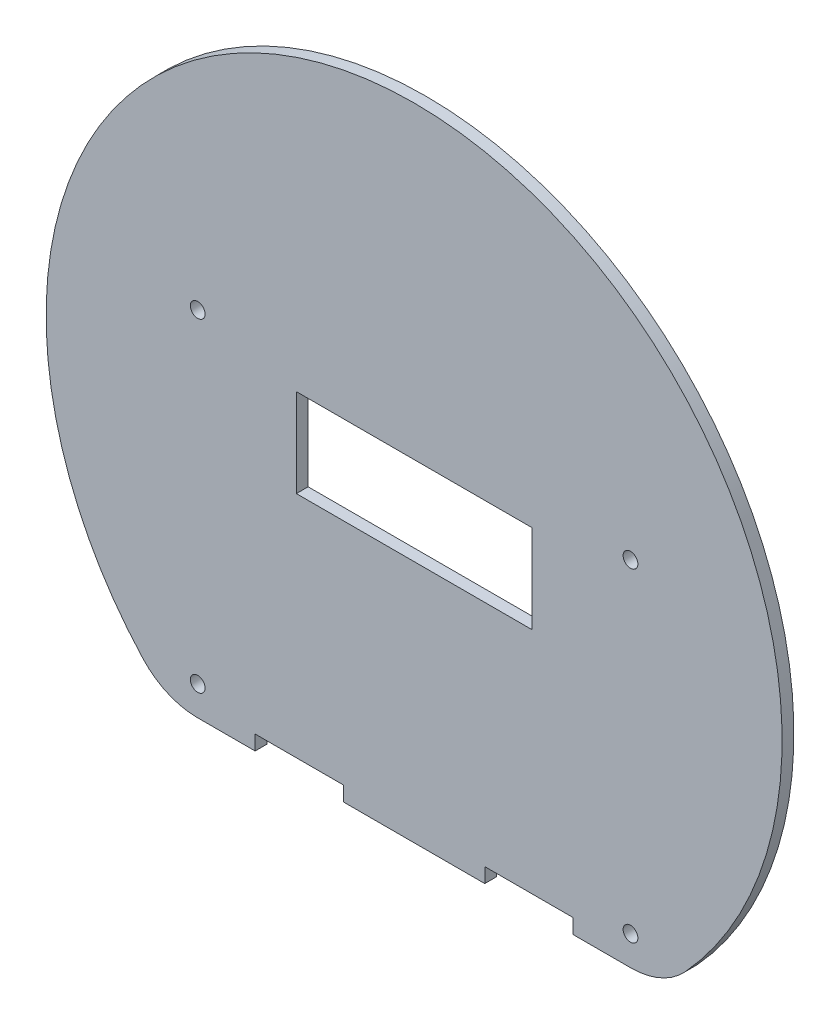
ISO-10303-21;
HEADER;
FILE_DESCRIPTION(('STEP AP214'),'2;1');
FILE_NAME('part.step','',(''),(''),'','','');
FILE_SCHEMA(('AUTOMOTIVE_DESIGN { 1 0 10303 214 1 1 1 1 }'));
ENDSEC;
DATA;
#1=APPLICATION_CONTEXT('core data for automotive mechanical design processes');
#2=APPLICATION_PROTOCOL_DEFINITION('international standard','automotive_design',2000,#1);
#3=PRODUCT_CONTEXT('',#1,'mechanical');
#4=PRODUCT('Part','Part','',(#3));
#5=PRODUCT_RELATED_PRODUCT_CATEGORY('part','',(#4));
#6=PRODUCT_DEFINITION_FORMATION('','',#4);
#7=PRODUCT_DEFINITION_CONTEXT('part definition',#1,'design');
#8=PRODUCT_DEFINITION('design','',#6,#7);
#9=PRODUCT_DEFINITION_SHAPE('','',#8);
#10=(LENGTH_UNIT() NAMED_UNIT(*) SI_UNIT(.MILLI.,.METRE.));
#11=(NAMED_UNIT(*) PLANE_ANGLE_UNIT() SI_UNIT($,.RADIAN.));
#12=(NAMED_UNIT(*) SI_UNIT($,.STERADIAN.) SOLID_ANGLE_UNIT());
#13=UNCERTAINTY_MEASURE_WITH_UNIT(LENGTH_MEASURE(1.E-05),#10,'distance_accuracy_value','');
#14=(GEOMETRIC_REPRESENTATION_CONTEXT(3) GLOBAL_UNCERTAINTY_ASSIGNED_CONTEXT((#13)) GLOBAL_UNIT_ASSIGNED_CONTEXT((#10,
#11,#12)) REPRESENTATION_CONTEXT('',''));
#15=CARTESIAN_POINT('',(0.,0.,0.));
#16=DIRECTION('',(0.,0.,1.));
#17=DIRECTION('',(1.,0.,0.));
#18=AXIS2_PLACEMENT_3D('',#15,#16,#17);
#19=CARTESIAN_POINT('',(-83.9155376460855,-92.6454669240131,-6.));
#20=DIRECTION('',(0.,1.,0.));
#21=DIRECTION('',(0.,0.,1.));
#22=AXIS2_PLACEMENT_3D('',#19,#20,#21);
#23=PLANE('',#22);
#24=DIRECTION('',(-1.,0.,0.));
#25=VECTOR('',#24,1.);
#26=CARTESIAN_POINT('',(0.,-92.6454669240131,0.));
#27=LINE('',#26,#25);
#28=CARTESIAN_POINT('',(24.,-92.6454669240131,0.));
#29=VERTEX_POINT('',#28);
#30=CARTESIAN_POINT('',(-24.,-92.6454669240131,0.));
#31=VERTEX_POINT('',#30);
#32=EDGE_CURVE('E258',#29,#31,#27,.T.);
#33=ORIENTED_EDGE('',*,*,#32,.F.);
#34=DIRECTION('',(0.,0.,1.));
#35=VECTOR('',#34,1.);
#36=CARTESIAN_POINT('',(24.,-92.6454669240131,-6.));
#37=LINE('',#36,#35);
#38=CARTESIAN_POINT('',(24.,-92.6454669240131,4.));
#39=VERTEX_POINT('',#38);
#40=EDGE_CURVE('E287',#29,#39,#37,.T.);
#41=ORIENTED_EDGE('',*,*,#40,.T.);
#42=DIRECTION('',(-1.,0.,0.));
#43=VECTOR('',#42,1.);
#44=CARTESIAN_POINT('',(-83.9155376460855,-92.6454669240131,4.));
#45=LINE('',#44,#43);
#46=CARTESIAN_POINT('',(-24.,-92.6454669240131,4.));
#47=VERTEX_POINT('',#46);
#48=EDGE_CURVE('E247',#39,#47,#45,.T.);
#49=ORIENTED_EDGE('',*,*,#48,.T.);
#50=DIRECTION('',(0.,0.,-1.));
#51=VECTOR('',#50,1.);
#52=CARTESIAN_POINT('',(-24.,-92.6454669240131,-6.));
#53=LINE('',#52,#51);
#54=EDGE_CURVE('E278',#47,#31,#53,.T.);
#55=ORIENTED_EDGE('',*,*,#54,.T.);
#56=EDGE_LOOP('',(#33,#41,#49,#55));
#57=FACE_BOUND('',#56,.T.);
#58=ADVANCED_FACE('F33',(#57),#23,.F.);
#59=CARTESIAN_POINT('',(-54.,-92.6454669240131,0.));
#60=VERTEX_POINT('',#59);
#61=CARTESIAN_POINT('',(-73.6484270343382,-92.6454669240131,0.));
#62=VERTEX_POINT('',#61);
#63=EDGE_CURVE('E251',#60,#62,#27,.T.);
#64=ORIENTED_EDGE('',*,*,#63,.F.);
#65=DIRECTION('',(0.,0.,1.));
#66=VECTOR('',#65,1.);
#67=CARTESIAN_POINT('',(-54.,-92.6454669240131,-6.));
#68=LINE('',#67,#66);
#69=CARTESIAN_POINT('',(-54.,-92.6454669240131,4.));
#70=VERTEX_POINT('',#69);
#71=EDGE_CURVE('E281',#60,#70,#68,.T.);
#72=ORIENTED_EDGE('',*,*,#71,.T.);
#73=CARTESIAN_POINT('',(-73.6484270343382,-92.6454669240131,4.));
#74=VERTEX_POINT('',#73);
#75=EDGE_CURVE('E242',#70,#74,#45,.T.);
#76=ORIENTED_EDGE('',*,*,#75,.T.);
#77=DIRECTION('',(0.,0.,-1.));
#78=VECTOR('',#77,1.);
#79=CARTESIAN_POINT('',(-73.6484270343382,-92.6454669240131,-6.));
#80=LINE('',#79,#78);
#81=EDGE_CURVE('E271',#74,#62,#80,.T.);
#82=ORIENTED_EDGE('',*,*,#81,.T.);
#83=EDGE_LOOP('',(#64,#72,#76,#82));
#84=FACE_BOUND('',#83,.T.);
#85=ADVANCED_FACE('F311',(#84),#23,.F.);
#86=CARTESIAN_POINT('',(0.,0.,4.));
#87=DIRECTION('',(0.,0.,-1.));
#88=DIRECTION('',(-1.,0.,0.));
#89=AXIS2_PLACEMENT_3D('',#86,#87,#88);
#90=CYLINDRICAL_SURFACE('',#89,125.);
#91=CARTESIAN_POINT('',(0.,0.,0.));
#92=DIRECTION('',(0.,0.,1.));
#93=DIRECTION('',(1.,0.,0.));
#94=AXIS2_PLACEMENT_3D('',#91,#92,#93);
#95=CIRCLE('',#94,125.);
#96=CARTESIAN_POINT('',(92.0605337929229,-84.5568336550164,0.));
#97=VERTEX_POINT('',#96);
#98=CARTESIAN_POINT('',(-92.0605337929228,-84.5568336550164,0.));
#99=VERTEX_POINT('',#98);
#100=EDGE_CURVE('E246',#97,#99,#95,.T.);
#101=ORIENTED_EDGE('',*,*,#100,.T.);
#102=DIRECTION('',(0.,0.,-1.));
#103=VECTOR('',#102,1.);
#104=CARTESIAN_POINT('',(-92.0605337929228,-84.5568336550164,4.));
#105=LINE('',#104,#103);
#106=CARTESIAN_POINT('',(-92.0605337929228,-84.5568336550164,4.));
#107=VERTEX_POINT('',#106);
#108=EDGE_CURVE('E260',#99,#107,#105,.F.);
#109=ORIENTED_EDGE('',*,*,#108,.T.);
#110=CARTESIAN_POINT('',(0.,0.,4.));
#111=DIRECTION('',(0.,0.,1.));
#112=DIRECTION('',(1.,0.,0.));
#113=AXIS2_PLACEMENT_3D('',#110,#111,#112);
#114=CIRCLE('',#113,125.);
#115=CARTESIAN_POINT('',(92.0605337929229,-84.5568336550164,4.));
#116=VERTEX_POINT('',#115);
#117=EDGE_CURVE('E248',#116,#107,#114,.T.);
#118=ORIENTED_EDGE('',*,*,#117,.F.);
#119=DIRECTION('',(0.,0.,-1.));
#120=VECTOR('',#119,1.);
#121=CARTESIAN_POINT('',(92.0605337929229,-84.5568336550164,4.));
#122=LINE('',#121,#120);
#123=EDGE_CURVE('E257',#116,#97,#122,.T.);
#124=ORIENTED_EDGE('',*,*,#123,.T.);
#125=EDGE_LOOP('',(#101,#109,#118,#124));
#126=FACE_BOUND('',#125,.T.);
#127=ADVANCED_FACE('F336',(#126),#90,.T.);
#128=CARTESIAN_POINT('',(0.,0.,4.));
#129=DIRECTION('',(0.,0.,1.));
#130=DIRECTION('',(1.,0.,0.));
#131=AXIS2_PLACEMENT_3D('',#128,#129,#130);
#132=PLANE('',#131);
#133=DIRECTION('',(0.,1.,0.));
#134=VECTOR('',#133,1.);
#135=CARTESIAN_POINT('',(40.,20.0744774174086,4.));
#136=LINE('',#135,#134);
#137=CARTESIAN_POINT('',(40.,-9.92552258259138,4.));
#138=VERTEX_POINT('',#137);
#139=CARTESIAN_POINT('',(40.,20.0744774174086,4.));
#140=VERTEX_POINT('',#139);
#141=EDGE_CURVE('E48',#138,#140,#136,.T.);
#142=ORIENTED_EDGE('',*,*,#141,.F.);
#143=DIRECTION('',(1.,0.,0.));
#144=VECTOR('',#143,1.);
#145=CARTESIAN_POINT('',(-40.,-9.92552258259138,4.));
#146=LINE('',#145,#144);
#147=CARTESIAN_POINT('',(-40.,-9.92552258259138,4.));
#148=VERTEX_POINT('',#147);
#149=EDGE_CURVE('E164',#148,#138,#146,.T.);
#150=ORIENTED_EDGE('',*,*,#149,.F.);
#151=DIRECTION('',(0.,-1.,0.));
#152=VECTOR('',#151,1.);
#153=CARTESIAN_POINT('',(-40.,20.0744774174086,4.));
#154=LINE('',#153,#152);
#155=CARTESIAN_POINT('',(-40.,20.0744774174086,4.));
#156=VERTEX_POINT('',#155);
#157=EDGE_CURVE('E167',#156,#148,#154,.T.);
#158=ORIENTED_EDGE('',*,*,#157,.F.);
#159=DIRECTION('',(-1.,0.,0.));
#160=VECTOR('',#159,1.);
#161=CARTESIAN_POINT('',(-40.,20.0744774174086,4.));
#162=LINE('',#161,#160);
#163=EDGE_CURVE('E173',#140,#156,#162,.T.);
#164=ORIENTED_EDGE('',*,*,#163,.F.);
#165=EDGE_LOOP('',(#142,#150,#158,#164));
#166=FACE_BOUND('',#165,.T.);
#167=CARTESIAN_POINT('',(-73.5,-82.6454669240131,4.));
#168=DIRECTION('',(0.,0.,1.));
#169=DIRECTION('',(1.,0.,0.));
#170=AXIS2_PLACEMENT_3D('',#167,#168,#169);
#171=CIRCLE('',#170,2.5);
#172=CARTESIAN_POINT('',(-71.,-82.6454669240131,4.));
#173=VERTEX_POINT('',#172);
#174=EDGE_CURVE('E179',#173,#173,#171,.T.);
#175=ORIENTED_EDGE('',*,*,#174,.F.);
#176=EDGE_LOOP('',(#175));
#177=FACE_BOUND('',#176,.T.);
#178=CARTESIAN_POINT('',(-73.5,27.3545330759869,4.));
#179=DIRECTION('',(0.,0.,1.));
#180=DIRECTION('',(1.,0.,0.));
#181=AXIS2_PLACEMENT_3D('',#178,#179,#180);
#182=CIRCLE('',#181,2.50000000000001);
#183=CARTESIAN_POINT('',(-71.,27.3545330759869,4.));
#184=VERTEX_POINT('',#183);
#185=EDGE_CURVE('E193',#184,#184,#182,.T.);
#186=ORIENTED_EDGE('',*,*,#185,.F.);
#187=EDGE_LOOP('',(#186));
#188=FACE_BOUND('',#187,.T.);
#189=CARTESIAN_POINT('',(73.5000000000001,27.3545330759869,4.));
#190=DIRECTION('',(0.,0.,1.));
#191=DIRECTION('',(1.,0.,0.));
#192=AXIS2_PLACEMENT_3D('',#189,#190,#191);
#193=CIRCLE('',#192,2.5);
#194=CARTESIAN_POINT('',(76.0000000000001,27.3545330759869,4.));
#195=VERTEX_POINT('',#194);
#196=EDGE_CURVE('E187',#195,#195,#193,.T.);
#197=ORIENTED_EDGE('',*,*,#196,.F.);
#198=EDGE_LOOP('',(#197));
#199=FACE_BOUND('',#198,.T.);
#200=CARTESIAN_POINT('',(73.5000000000001,-82.6454669240131,4.));
#201=DIRECTION('',(0.,0.,1.));
#202=DIRECTION('',(1.,0.,0.));
#203=AXIS2_PLACEMENT_3D('',#200,#201,#202);
#204=CIRCLE('',#203,2.50000000000001);
#205=CARTESIAN_POINT('',(76.0000000000001,-82.6454669240131,4.));
#206=VERTEX_POINT('',#205);
#207=EDGE_CURVE('E186',#206,#206,#204,.T.);
#208=ORIENTED_EDGE('',*,*,#207,.F.);
#209=EDGE_LOOP('',(#208));
#210=FACE_BOUND('',#209,.T.);
#211=DIRECTION('',(0.,-1.,0.));
#212=VECTOR('',#211,1.);
#213=CARTESIAN_POINT('',(24.,-92.6454669240131,4.));
#214=LINE('',#213,#212);
#215=CARTESIAN_POINT('',(24.,-87.6454669240131,4.));
#216=VERTEX_POINT('',#215);
#217=EDGE_CURVE('E207',#216,#39,#214,.T.);
#218=ORIENTED_EDGE('',*,*,#217,.F.);
#219=DIRECTION('',(-1.,0.,0.));
#220=VECTOR('',#219,1.);
#221=CARTESIAN_POINT('',(24.,-87.6454669240131,4.));
#222=LINE('',#221,#220);
#223=CARTESIAN_POINT('',(54.,-87.6454669240131,4.));
#224=VERTEX_POINT('',#223);
#225=EDGE_CURVE('E213',#224,#216,#222,.T.);
#226=ORIENTED_EDGE('',*,*,#225,.F.);
#227=DIRECTION('',(0.,1.,0.));
#228=VECTOR('',#227,1.);
#229=CARTESIAN_POINT('',(54.,-92.6454669240131,4.));
#230=LINE('',#229,#228);
#231=CARTESIAN_POINT('',(54.,-92.6454669240131,4.));
#232=VERTEX_POINT('',#231);
#233=EDGE_CURVE('E209',#232,#224,#230,.T.);
#234=ORIENTED_EDGE('',*,*,#233,.F.);
#235=CARTESIAN_POINT('',(73.6484270343383,-92.6454669240131,4.));
#236=VERTEX_POINT('',#235);
#237=EDGE_CURVE('E243',#236,#232,#45,.T.);
#238=ORIENTED_EDGE('',*,*,#237,.F.);
#239=CARTESIAN_POINT('',(73.6484270343383,-67.6454669240131,4.));
#240=DIRECTION('',(0.,0.,1.));
#241=DIRECTION('',(1.,0.,0.));
#242=AXIS2_PLACEMENT_3D('',#239,#240,#241);
#243=CIRCLE('',#242,25.);
#244=EDGE_CURVE('E263',#236,#116,#243,.T.);
#245=ORIENTED_EDGE('',*,*,#244,.T.);
#246=ORIENTED_EDGE('',*,*,#117,.T.);
#247=CARTESIAN_POINT('',(-73.6484270343382,-67.6454669240131,4.));
#248=DIRECTION('',(0.,0.,1.));
#249=DIRECTION('',(1.,0.,0.));
#250=AXIS2_PLACEMENT_3D('',#247,#248,#249);
#251=CIRCLE('',#250,25.);
#252=EDGE_CURVE('E265',#107,#74,#251,.T.);
#253=ORIENTED_EDGE('',*,*,#252,.T.);
#254=ORIENTED_EDGE('',*,*,#75,.F.);
#255=DIRECTION('',(0.,-1.,0.));
#256=VECTOR('',#255,1.);
#257=CARTESIAN_POINT('',(-54.,-92.6454669240131,4.));
#258=LINE('',#257,#256);
#259=CARTESIAN_POINT('',(-54.,-87.6454669240132,4.));
#260=VERTEX_POINT('',#259);
#261=EDGE_CURVE('E226',#260,#70,#258,.T.);
#262=ORIENTED_EDGE('',*,*,#261,.F.);
#263=DIRECTION('',(-1.,0.,0.));
#264=VECTOR('',#263,1.);
#265=CARTESIAN_POINT('',(-24.,-87.6454669240132,4.));
#266=LINE('',#265,#264);
#267=CARTESIAN_POINT('',(-24.,-87.6454669240132,4.));
#268=VERTEX_POINT('',#267);
#269=EDGE_CURVE('E223',#268,#260,#266,.T.);
#270=ORIENTED_EDGE('',*,*,#269,.F.);
#271=DIRECTION('',(0.,1.,0.));
#272=VECTOR('',#271,1.);
#273=CARTESIAN_POINT('',(-24.,-92.6454669240131,4.));
#274=LINE('',#273,#272);
#275=EDGE_CURVE('E204',#47,#268,#274,.T.);
#276=ORIENTED_EDGE('',*,*,#275,.F.);
#277=ORIENTED_EDGE('',*,*,#48,.F.);
#278=EDGE_LOOP('',(#218,#226,#234,#238,#245,#246,#253,#254,#262,#270,#276,#277));
#279=FACE_BOUND('',#278,.T.);
#280=ADVANCED_FACE('F306',(#166,#177,#188,#199,#210,#279),#132,.T.);
#281=CARTESIAN_POINT('',(0.,0.,0.));
#282=DIRECTION('',(0.,0.,1.));
#283=DIRECTION('',(1.,0.,0.));
#284=AXIS2_PLACEMENT_3D('',#281,#282,#283);
#285=PLANE('',#284);
#286=DIRECTION('',(1.,0.,0.));
#287=VECTOR('',#286,1.);
#288=CARTESIAN_POINT('',(-40.,-9.92552258259138,0.));
#289=LINE('',#288,#287);
#290=CARTESIAN_POINT('',(-40.,-9.92552258259138,0.));
#291=VERTEX_POINT('',#290);
#292=CARTESIAN_POINT('',(40.,-9.92552258259138,0.));
#293=VERTEX_POINT('',#292);
#294=EDGE_CURVE('E154',#291,#293,#289,.T.);
#295=ORIENTED_EDGE('',*,*,#294,.T.);
#296=DIRECTION('',(0.,1.,0.));
#297=VECTOR('',#296,1.);
#298=CARTESIAN_POINT('',(40.,20.0744774174086,0.));
#299=LINE('',#298,#297);
#300=CARTESIAN_POINT('',(40.,20.0744774174086,0.));
#301=VERTEX_POINT('',#300);
#302=EDGE_CURVE('E148',#293,#301,#299,.T.);
#303=ORIENTED_EDGE('',*,*,#302,.T.);
#304=DIRECTION('',(-1.,0.,0.));
#305=VECTOR('',#304,1.);
#306=CARTESIAN_POINT('',(-40.,20.0744774174086,0.));
#307=LINE('',#306,#305);
#308=CARTESIAN_POINT('',(-40.,20.0744774174086,0.));
#309=VERTEX_POINT('',#308);
#310=EDGE_CURVE('E157',#301,#309,#307,.T.);
#311=ORIENTED_EDGE('',*,*,#310,.T.);
#312=DIRECTION('',(0.,-1.,0.));
#313=VECTOR('',#312,1.);
#314=CARTESIAN_POINT('',(-40.,20.0744774174086,0.));
#315=LINE('',#314,#313);
#316=EDGE_CURVE('E56',#309,#291,#315,.T.);
#317=ORIENTED_EDGE('',*,*,#316,.T.);
#318=EDGE_LOOP('',(#295,#303,#311,#317));
#319=FACE_BOUND('',#318,.T.);
#320=CARTESIAN_POINT('',(-73.5,-82.6454669240131,0.));
#321=DIRECTION('',(0.,0.,1.));
#322=DIRECTION('',(1.,0.,0.));
#323=AXIS2_PLACEMENT_3D('',#320,#321,#322);
#324=CIRCLE('',#323,2.5);
#325=CARTESIAN_POINT('',(-71.,-82.6454669240131,0.));
#326=VERTEX_POINT('',#325);
#327=EDGE_CURVE('E196',#326,#326,#324,.T.);
#328=ORIENTED_EDGE('',*,*,#327,.T.);
#329=EDGE_LOOP('',(#328));
#330=FACE_BOUND('',#329,.T.);
#331=CARTESIAN_POINT('',(-73.5,27.3545330759869,0.));
#332=DIRECTION('',(0.,0.,1.));
#333=DIRECTION('',(1.,0.,0.));
#334=AXIS2_PLACEMENT_3D('',#331,#332,#333);
#335=CIRCLE('',#334,2.50000000000001);
#336=CARTESIAN_POINT('',(-71.,27.3545330759869,0.));
#337=VERTEX_POINT('',#336);
#338=EDGE_CURVE('E190',#337,#337,#335,.T.);
#339=ORIENTED_EDGE('',*,*,#338,.T.);
#340=EDGE_LOOP('',(#339));
#341=FACE_BOUND('',#340,.T.);
#342=CARTESIAN_POINT('',(73.5000000000001,27.3545330759869,0.));
#343=DIRECTION('',(0.,0.,1.));
#344=DIRECTION('',(1.,0.,0.));
#345=AXIS2_PLACEMENT_3D('',#342,#343,#344);
#346=CIRCLE('',#345,2.5);
#347=CARTESIAN_POINT('',(76.0000000000001,27.3545330759869,0.));
#348=VERTEX_POINT('',#347);
#349=EDGE_CURVE('E183',#348,#348,#346,.T.);
#350=ORIENTED_EDGE('',*,*,#349,.T.);
#351=EDGE_LOOP('',(#350));
#352=FACE_BOUND('',#351,.T.);
#353=CARTESIAN_POINT('',(73.5000000000001,-82.6454669240131,0.));
#354=DIRECTION('',(0.,0.,1.));
#355=DIRECTION('',(1.,0.,0.));
#356=AXIS2_PLACEMENT_3D('',#353,#354,#355);
#357=CIRCLE('',#356,2.50000000000001);
#358=CARTESIAN_POINT('',(76.0000000000001,-82.6454669240131,0.));
#359=VERTEX_POINT('',#358);
#360=EDGE_CURVE('E201',#359,#359,#357,.T.);
#361=ORIENTED_EDGE('',*,*,#360,.T.);
#362=EDGE_LOOP('',(#361));
#363=FACE_BOUND('',#362,.T.);
#364=DIRECTION('',(-1.,0.,0.));
#365=VECTOR('',#364,1.);
#366=CARTESIAN_POINT('',(0.,-87.6454669240131,0.));
#367=LINE('',#366,#365);
#368=CARTESIAN_POINT('',(54.,-87.6454669240131,0.));
#369=VERTEX_POINT('',#368);
#370=CARTESIAN_POINT('',(24.,-87.6454669240131,0.));
#371=VERTEX_POINT('',#370);
#372=EDGE_CURVE('E11',#369,#371,#367,.T.);
#373=ORIENTED_EDGE('',*,*,#372,.T.);
#374=DIRECTION('',(0.,-1.,0.));
#375=VECTOR('',#374,1.);
#376=CARTESIAN_POINT('',(24.,0.,0.));
#377=LINE('',#376,#375);
#378=EDGE_CURVE('E239',#371,#29,#377,.T.);
#379=ORIENTED_EDGE('',*,*,#378,.T.);
#380=ORIENTED_EDGE('',*,*,#32,.T.);
#381=DIRECTION('',(0.,1.,0.));
#382=VECTOR('',#381,1.);
#383=CARTESIAN_POINT('',(-24.,0.,0.));
#384=LINE('',#383,#382);
#385=CARTESIAN_POINT('',(-24.,-87.6454669240132,0.));
#386=VERTEX_POINT('',#385);
#387=EDGE_CURVE('E219',#31,#386,#384,.T.);
#388=ORIENTED_EDGE('',*,*,#387,.T.);
#389=DIRECTION('',(-1.,0.,0.));
#390=VECTOR('',#389,1.);
#391=CARTESIAN_POINT('',(0.,-87.6454669240132,0.));
#392=LINE('',#391,#390);
#393=CARTESIAN_POINT('',(-54.,-87.6454669240132,0.));
#394=VERTEX_POINT('',#393);
#395=EDGE_CURVE('E41',#386,#394,#392,.T.);
#396=ORIENTED_EDGE('',*,*,#395,.T.);
#397=DIRECTION('',(0.,-1.,0.));
#398=VECTOR('',#397,1.);
#399=CARTESIAN_POINT('',(-54.,0.,0.));
#400=LINE('',#399,#398);
#401=EDGE_CURVE('E233',#394,#60,#400,.T.);
#402=ORIENTED_EDGE('',*,*,#401,.T.);
#403=ORIENTED_EDGE('',*,*,#63,.T.);
#404=CARTESIAN_POINT('',(-73.6484270343382,-67.6454669240131,0.));
#405=DIRECTION('',(0.,0.,1.));
#406=DIRECTION('',(1.,0.,0.));
#407=AXIS2_PLACEMENT_3D('',#404,#405,#406);
#408=CIRCLE('',#407,25.);
#409=EDGE_CURVE('E276',#62,#99,#408,.F.);
#410=ORIENTED_EDGE('',*,*,#409,.T.);
#411=ORIENTED_EDGE('',*,*,#100,.F.);
#412=CARTESIAN_POINT('',(73.6484270343383,-67.6454669240131,0.));
#413=DIRECTION('',(0.,0.,1.));
#414=DIRECTION('',(1.,0.,0.));
#415=AXIS2_PLACEMENT_3D('',#412,#413,#414);
#416=CIRCLE('',#415,25.);
#417=CARTESIAN_POINT('',(73.6484270343383,-92.6454669240131,0.));
#418=VERTEX_POINT('',#417);
#419=EDGE_CURVE('E274',#97,#418,#416,.F.);
#420=ORIENTED_EDGE('',*,*,#419,.T.);
#421=CARTESIAN_POINT('',(54.,-92.6454669240131,0.));
#422=VERTEX_POINT('',#421);
#423=EDGE_CURVE('E254',#418,#422,#27,.T.);
#424=ORIENTED_EDGE('',*,*,#423,.T.);
#425=DIRECTION('',(0.,1.,0.));
#426=VECTOR('',#425,1.);
#427=CARTESIAN_POINT('',(54.,0.,0.));
#428=LINE('',#427,#426);
#429=EDGE_CURVE('E236',#422,#369,#428,.T.);
#430=ORIENTED_EDGE('',*,*,#429,.T.);
#431=EDGE_LOOP('',(#373,#379,#380,#388,#396,#402,#403,#410,#411,#420,#424,#430));
#432=FACE_BOUND('',#431,.T.);
#433=ADVANCED_FACE('F161',(#319,#330,#341,#352,#363,#432),#285,.F.);
#434=ORIENTED_EDGE('',*,*,#237,.T.);
#435=DIRECTION('',(0.,0.,-1.));
#436=VECTOR('',#435,1.);
#437=CARTESIAN_POINT('',(54.,-92.6454669240131,-6.));
#438=LINE('',#437,#436);
#439=EDGE_CURVE('E284',#232,#422,#438,.T.);
#440=ORIENTED_EDGE('',*,*,#439,.T.);
#441=ORIENTED_EDGE('',*,*,#423,.F.);
#442=DIRECTION('',(0.,0.,-1.));
#443=VECTOR('',#442,1.);
#444=CARTESIAN_POINT('',(73.6484270343383,-92.6454669240131,-6.));
#445=LINE('',#444,#443);
#446=EDGE_CURVE('E268',#418,#236,#445,.F.);
#447=ORIENTED_EDGE('',*,*,#446,.T.);
#448=EDGE_LOOP('',(#434,#440,#441,#447));
#449=FACE_BOUND('',#448,.T.);
#450=ADVANCED_FACE('F328',(#449),#23,.F.);
#451=CARTESIAN_POINT('',(-73.6484270343382,-67.6454669240131,4.));
#452=DIRECTION('',(0.,0.,-1.));
#453=DIRECTION('',(-1.,0.,0.));
#454=AXIS2_PLACEMENT_3D('',#451,#452,#453);
#455=CYLINDRICAL_SURFACE('',#454,25.);
#456=ORIENTED_EDGE('',*,*,#409,.F.);
#457=ORIENTED_EDGE('',*,*,#81,.F.);
#458=ORIENTED_EDGE('',*,*,#252,.F.);
#459=ORIENTED_EDGE('',*,*,#108,.F.);
#460=EDGE_LOOP('',(#456,#457,#458,#459));
#461=FACE_BOUND('',#460,.T.);
#462=ADVANCED_FACE('F340',(#461),#455,.T.);
#463=CARTESIAN_POINT('',(73.6484270343383,-67.6454669240131,4.));
#464=DIRECTION('',(0.,0.,-1.));
#465=DIRECTION('',(-1.,0.,0.));
#466=AXIS2_PLACEMENT_3D('',#463,#464,#465);
#467=CYLINDRICAL_SURFACE('',#466,25.);
#468=ORIENTED_EDGE('',*,*,#419,.F.);
#469=ORIENTED_EDGE('',*,*,#123,.F.);
#470=ORIENTED_EDGE('',*,*,#244,.F.);
#471=ORIENTED_EDGE('',*,*,#446,.F.);
#472=EDGE_LOOP('',(#468,#469,#470,#471));
#473=FACE_BOUND('',#472,.T.);
#474=ADVANCED_FACE('F35',(#473),#467,.T.);
#475=CARTESIAN_POINT('',(-24.,-87.6454669240132,-1.));
#476=DIRECTION('',(0.,1.,0.));
#477=DIRECTION('',(0.,0.,1.));
#478=AXIS2_PLACEMENT_3D('',#475,#476,#477);
#479=PLANE('',#478);
#480=DIRECTION('',(0.,0.,1.));
#481=VECTOR('',#480,1.);
#482=CARTESIAN_POINT('',(-24.,-87.6454669240132,-1.));
#483=LINE('',#482,#481);
#484=EDGE_CURVE('E228',#386,#268,#483,.T.);
#485=ORIENTED_EDGE('',*,*,#484,.T.);
#486=ORIENTED_EDGE('',*,*,#269,.T.);
#487=DIRECTION('',(0.,0.,1.));
#488=VECTOR('',#487,1.);
#489=CARTESIAN_POINT('',(-54.,-87.6454669240132,-1.));
#490=LINE('',#489,#488);
#491=EDGE_CURVE('E210',#394,#260,#490,.T.);
#492=ORIENTED_EDGE('',*,*,#491,.F.);
#493=ORIENTED_EDGE('',*,*,#395,.F.);
#494=EDGE_LOOP('',(#485,#486,#492,#493));
#495=FACE_BOUND('',#494,.T.);
#496=ADVANCED_FACE('F296',(#495),#479,.F.);
#497=CARTESIAN_POINT('',(-54.,-92.6454669240131,-1.));
#498=DIRECTION('',(-1.,0.,0.));
#499=DIRECTION('',(0.,0.,1.));
#500=AXIS2_PLACEMENT_3D('',#497,#498,#499);
#501=PLANE('',#500);
#502=ORIENTED_EDGE('',*,*,#491,.T.);
#503=ORIENTED_EDGE('',*,*,#261,.T.);
#504=ORIENTED_EDGE('',*,*,#71,.F.);
#505=ORIENTED_EDGE('',*,*,#401,.F.);
#506=EDGE_LOOP('',(#502,#503,#504,#505));
#507=FACE_BOUND('',#506,.T.);
#508=ADVANCED_FACE('F309',(#507),#501,.F.);
#509=CARTESIAN_POINT('',(-24.,-92.6454669240131,-1.));
#510=DIRECTION('',(1.,0.,0.));
#511=DIRECTION('',(0.,0.,-1.));
#512=AXIS2_PLACEMENT_3D('',#509,#510,#511);
#513=PLANE('',#512);
#514=ORIENTED_EDGE('',*,*,#54,.F.);
#515=ORIENTED_EDGE('',*,*,#275,.T.);
#516=ORIENTED_EDGE('',*,*,#484,.F.);
#517=ORIENTED_EDGE('',*,*,#387,.F.);
#518=EDGE_LOOP('',(#514,#515,#516,#517));
#519=FACE_BOUND('',#518,.T.);
#520=ADVANCED_FACE('F298',(#519),#513,.F.);
#521=CARTESIAN_POINT('',(24.,-87.6454669240131,-1.));
#522=DIRECTION('',(0.,1.,0.));
#523=DIRECTION('',(0.,0.,1.));
#524=AXIS2_PLACEMENT_3D('',#521,#522,#523);
#525=PLANE('',#524);
#526=DIRECTION('',(0.,0.,1.));
#527=VECTOR('',#526,1.);
#528=CARTESIAN_POINT('',(54.,-87.6454669240131,-1.));
#529=LINE('',#528,#527);
#530=EDGE_CURVE('E216',#369,#224,#529,.T.);
#531=ORIENTED_EDGE('',*,*,#530,.T.);
#532=ORIENTED_EDGE('',*,*,#225,.T.);
#533=DIRECTION('',(0.,0.,1.));
#534=VECTOR('',#533,1.);
#535=CARTESIAN_POINT('',(24.,-87.6454669240131,-1.));
#536=LINE('',#535,#534);
#537=EDGE_CURVE('E217',#371,#216,#536,.T.);
#538=ORIENTED_EDGE('',*,*,#537,.F.);
#539=ORIENTED_EDGE('',*,*,#372,.F.);
#540=EDGE_LOOP('',(#531,#532,#538,#539));
#541=FACE_BOUND('',#540,.T.);
#542=ADVANCED_FACE('F322',(#541),#525,.F.);
#543=CARTESIAN_POINT('',(24.,-92.6454669240131,-1.));
#544=DIRECTION('',(-1.,0.,0.));
#545=DIRECTION('',(0.,0.,1.));
#546=AXIS2_PLACEMENT_3D('',#543,#544,#545);
#547=PLANE('',#546);
#548=ORIENTED_EDGE('',*,*,#537,.T.);
#549=ORIENTED_EDGE('',*,*,#217,.T.);
#550=ORIENTED_EDGE('',*,*,#40,.F.);
#551=ORIENTED_EDGE('',*,*,#378,.F.);
#552=EDGE_LOOP('',(#548,#549,#550,#551));
#553=FACE_BOUND('',#552,.T.);
#554=ADVANCED_FACE('F319',(#553),#547,.F.);
#555=CARTESIAN_POINT('',(54.,-92.6454669240131,-1.));
#556=DIRECTION('',(1.,0.,0.));
#557=DIRECTION('',(0.,0.,-1.));
#558=AXIS2_PLACEMENT_3D('',#555,#556,#557);
#559=PLANE('',#558);
#560=ORIENTED_EDGE('',*,*,#439,.F.);
#561=ORIENTED_EDGE('',*,*,#233,.T.);
#562=ORIENTED_EDGE('',*,*,#530,.F.);
#563=ORIENTED_EDGE('',*,*,#429,.F.);
#564=EDGE_LOOP('',(#560,#561,#562,#563));
#565=FACE_BOUND('',#564,.T.);
#566=ADVANCED_FACE('F325',(#565),#559,.F.);
#567=CARTESIAN_POINT('',(73.5000000000001,-82.6454669240131,0.));
#568=DIRECTION('',(0.,0.,1.));
#569=DIRECTION('',(1.,0.,0.));
#570=AXIS2_PLACEMENT_3D('',#567,#568,#569);
#571=CYLINDRICAL_SURFACE('',#570,2.50000000000001);
#572=ORIENTED_EDGE('',*,*,#360,.F.);
#573=EDGE_LOOP('',(#572));
#574=FACE_BOUND('',#573,.T.);
#575=ORIENTED_EDGE('',*,*,#207,.T.);
#576=EDGE_LOOP('',(#575));
#577=FACE_BOUND('',#576,.T.);
#578=ADVANCED_FACE('F433',(#574,#577),#571,.F.);
#579=CARTESIAN_POINT('',(73.5000000000001,27.3545330759869,0.));
#580=DIRECTION('',(0.,0.,1.));
#581=DIRECTION('',(1.,0.,0.));
#582=AXIS2_PLACEMENT_3D('',#579,#580,#581);
#583=CYLINDRICAL_SURFACE('',#582,2.5);
#584=ORIENTED_EDGE('',*,*,#349,.F.);
#585=EDGE_LOOP('',(#584));
#586=FACE_BOUND('',#585,.T.);
#587=ORIENTED_EDGE('',*,*,#196,.T.);
#588=EDGE_LOOP('',(#587));
#589=FACE_BOUND('',#588,.T.);
#590=ADVANCED_FACE('F442',(#586,#589),#583,.F.);
#591=CARTESIAN_POINT('',(-73.5,27.3545330759869,0.));
#592=DIRECTION('',(0.,0.,1.));
#593=DIRECTION('',(1.,0.,0.));
#594=AXIS2_PLACEMENT_3D('',#591,#592,#593);
#595=CYLINDRICAL_SURFACE('',#594,2.50000000000001);
#596=ORIENTED_EDGE('',*,*,#338,.F.);
#597=EDGE_LOOP('',(#596));
#598=FACE_BOUND('',#597,.T.);
#599=ORIENTED_EDGE('',*,*,#185,.T.);
#600=EDGE_LOOP('',(#599));
#601=FACE_BOUND('',#600,.T.);
#602=ADVANCED_FACE('F452',(#598,#601),#595,.F.);
#603=CARTESIAN_POINT('',(-73.5,-82.6454669240131,0.));
#604=DIRECTION('',(0.,0.,1.));
#605=DIRECTION('',(1.,0.,0.));
#606=AXIS2_PLACEMENT_3D('',#603,#604,#605);
#607=CYLINDRICAL_SURFACE('',#606,2.5);
#608=ORIENTED_EDGE('',*,*,#327,.F.);
#609=EDGE_LOOP('',(#608));
#610=FACE_BOUND('',#609,.T.);
#611=ORIENTED_EDGE('',*,*,#174,.T.);
#612=EDGE_LOOP('',(#611));
#613=FACE_BOUND('',#612,.T.);
#614=ADVANCED_FACE('F461',(#610,#613),#607,.F.);
#615=CARTESIAN_POINT('',(40.,20.0744774174086,0.));
#616=DIRECTION('',(1.,0.,0.));
#617=DIRECTION('',(0.,1.,0.));
#618=AXIS2_PLACEMENT_3D('',#615,#616,#617);
#619=PLANE('',#618);
#620=ORIENTED_EDGE('',*,*,#141,.T.);
#621=DIRECTION('',(0.,0.,1.));
#622=VECTOR('',#621,1.);
#623=CARTESIAN_POINT('',(40.,20.0744774174086,0.));
#624=LINE('',#623,#622);
#625=EDGE_CURVE('E144',#301,#140,#624,.T.);
#626=ORIENTED_EDGE('',*,*,#625,.F.);
#627=ORIENTED_EDGE('',*,*,#302,.F.);
#628=DIRECTION('',(0.,0.,1.));
#629=VECTOR('',#628,1.);
#630=CARTESIAN_POINT('',(40.,-9.92552258259138,0.));
#631=LINE('',#630,#629);
#632=EDGE_CURVE('E177',#293,#138,#631,.T.);
#633=ORIENTED_EDGE('',*,*,#632,.T.);
#634=EDGE_LOOP('',(#620,#626,#627,#633));
#635=FACE_BOUND('',#634,.T.);
#636=ADVANCED_FACE('F146',(#635),#619,.F.);
#637=CARTESIAN_POINT('',(-40.,-9.92552258259138,0.));
#638=DIRECTION('',(0.,-1.,0.));
#639=DIRECTION('',(0.,0.,-1.));
#640=AXIS2_PLACEMENT_3D('',#637,#638,#639);
#641=PLANE('',#640);
#642=ORIENTED_EDGE('',*,*,#149,.T.);
#643=ORIENTED_EDGE('',*,*,#632,.F.);
#644=ORIENTED_EDGE('',*,*,#294,.F.);
#645=DIRECTION('',(0.,0.,1.));
#646=VECTOR('',#645,1.);
#647=CARTESIAN_POINT('',(-40.,-9.92552258259138,0.));
#648=LINE('',#647,#646);
#649=EDGE_CURVE('E180',#291,#148,#648,.T.);
#650=ORIENTED_EDGE('',*,*,#649,.T.);
#651=EDGE_LOOP('',(#642,#643,#644,#650));
#652=FACE_BOUND('',#651,.T.);
#653=ADVANCED_FACE('F479',(#652),#641,.F.);
#654=CARTESIAN_POINT('',(-40.,20.0744774174086,0.));
#655=DIRECTION('',(-1.,0.,0.));
#656=DIRECTION('',(0.,0.,1.));
#657=AXIS2_PLACEMENT_3D('',#654,#655,#656);
#658=PLANE('',#657);
#659=ORIENTED_EDGE('',*,*,#157,.T.);
#660=ORIENTED_EDGE('',*,*,#649,.F.);
#661=ORIENTED_EDGE('',*,*,#316,.F.);
#662=DIRECTION('',(0.,0.,1.));
#663=VECTOR('',#662,1.);
#664=CARTESIAN_POINT('',(-40.,20.0744774174086,0.));
#665=LINE('',#664,#663);
#666=EDGE_CURVE('E153',#309,#156,#665,.T.);
#667=ORIENTED_EDGE('',*,*,#666,.T.);
#668=EDGE_LOOP('',(#659,#660,#661,#667));
#669=FACE_BOUND('',#668,.T.);
#670=ADVANCED_FACE('F485',(#669),#658,.F.);
#671=CARTESIAN_POINT('',(-40.,20.0744774174086,0.));
#672=DIRECTION('',(0.,1.,0.));
#673=DIRECTION('',(0.,0.,1.));
#674=AXIS2_PLACEMENT_3D('',#671,#672,#673);
#675=PLANE('',#674);
#676=ORIENTED_EDGE('',*,*,#163,.T.);
#677=ORIENTED_EDGE('',*,*,#666,.F.);
#678=ORIENTED_EDGE('',*,*,#310,.F.);
#679=ORIENTED_EDGE('',*,*,#625,.T.);
#680=EDGE_LOOP('',(#676,#677,#678,#679));
#681=FACE_BOUND('',#680,.T.);
#682=ADVANCED_FACE('F158',(#681),#675,.F.);
#683=CLOSED_SHELL('',(#58,#85,#127,#280,#433,#450,#462,#474,#496,#508,#520,#542,#554,#566,#578,
#590,#602,#614,#636,#653,#670,#682));
#684=MANIFOLD_SOLID_BREP('B2',#683);
#685=ADVANCED_BREP_SHAPE_REPRESENTATION('',(#18,#684),#14);
#686=SHAPE_DEFINITION_REPRESENTATION(#9,#685);
ENDSEC;
END-ISO-10303-21;
